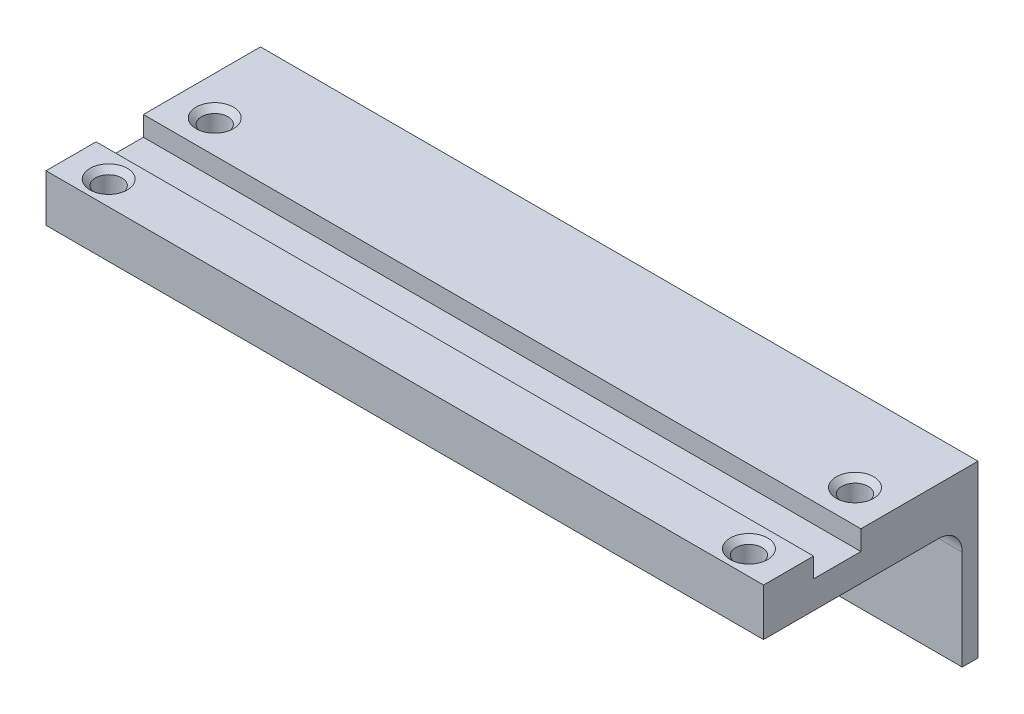
ISO-10303-21;
HEADER;
FILE_DESCRIPTION(('STEP AP214'),'2;1');
FILE_NAME('part.step','',(''),(''),'','','');
FILE_SCHEMA(('AUTOMOTIVE_DESIGN { 1 0 10303 214 1 1 1 1 }'));
ENDSEC;
DATA;
#1=APPLICATION_CONTEXT('core data for automotive mechanical design processes');
#2=APPLICATION_PROTOCOL_DEFINITION('international standard','automotive_design',2000,#1);
#3=PRODUCT_CONTEXT('',#1,'mechanical');
#4=PRODUCT('Part','Part','',(#3));
#5=PRODUCT_RELATED_PRODUCT_CATEGORY('part','',(#4));
#6=PRODUCT_DEFINITION_FORMATION('','',#4);
#7=PRODUCT_DEFINITION_CONTEXT('part definition',#1,'design');
#8=PRODUCT_DEFINITION('design','',#6,#7);
#9=PRODUCT_DEFINITION_SHAPE('','',#8);
#10=(LENGTH_UNIT() NAMED_UNIT(*) SI_UNIT(.MILLI.,.METRE.));
#11=(NAMED_UNIT(*) PLANE_ANGLE_UNIT() SI_UNIT($,.RADIAN.));
#12=(NAMED_UNIT(*) SI_UNIT($,.STERADIAN.) SOLID_ANGLE_UNIT());
#13=UNCERTAINTY_MEASURE_WITH_UNIT(LENGTH_MEASURE(1.E-05),#10,'distance_accuracy_value','');
#14=(GEOMETRIC_REPRESENTATION_CONTEXT(3) GLOBAL_UNCERTAINTY_ASSIGNED_CONTEXT((#13)) GLOBAL_UNIT_ASSIGNED_CONTEXT((#10,
#11,#12)) REPRESENTATION_CONTEXT('',''));
#15=CARTESIAN_POINT('',(0.,0.,0.));
#16=DIRECTION('',(0.,0.,1.));
#17=DIRECTION('',(1.,0.,0.));
#18=AXIS2_PLACEMENT_3D('',#15,#16,#17);
#19=CARTESIAN_POINT('',(0.,4.,0.));
#20=DIRECTION('',(0.,1.,0.));
#21=DIRECTION('',(0.,0.,1.));
#22=AXIS2_PLACEMENT_3D('',#19,#20,#21);
#23=PLANE('',#22);
#24=CARTESIAN_POINT('',(-40.6,4.,-3.5));
#25=DIRECTION('',(0.,1.,0.));
#26=DIRECTION('',(0.,0.,1.));
#27=AXIS2_PLACEMENT_3D('',#24,#25,#26);
#28=CIRCLE('',#27,2.375);
#29=CARTESIAN_POINT('',(-40.6,4.,-1.125));
#30=VERTEX_POINT('',#29);
#31=EDGE_CURVE('E255',#30,#30,#28,.F.);
#32=ORIENTED_EDGE('',*,*,#31,.T.);
#33=EDGE_LOOP('',(#32));
#34=FACE_BOUND('',#33,.T.);
#35=CARTESIAN_POINT('',(40.6,4.,-3.5));
#36=DIRECTION('',(0.,1.,0.));
#37=DIRECTION('',(0.,0.,1.));
#38=AXIS2_PLACEMENT_3D('',#35,#36,#37);
#39=CIRCLE('',#38,2.375);
#40=CARTESIAN_POINT('',(40.6,4.,-1.125));
#41=VERTEX_POINT('',#40);
#42=EDGE_CURVE('E252',#41,#41,#39,.F.);
#43=ORIENTED_EDGE('',*,*,#42,.T.);
#44=EDGE_LOOP('',(#43));
#45=FACE_BOUND('',#44,.T.);
#46=DIRECTION('',(0.,0.,1.));
#47=VECTOR('',#46,1.);
#48=CARTESIAN_POINT('',(-45.5,4.,-12.));
#49=LINE('',#48,#47);
#50=CARTESIAN_POINT('',(-45.5,4.,-14.2));
#51=VERTEX_POINT('',#50);
#52=CARTESIAN_POINT('',(-45.5,4.,0.65));
#53=VERTEX_POINT('',#52);
#54=EDGE_CURVE('E237',#51,#53,#49,.T.);
#55=ORIENTED_EDGE('',*,*,#54,.T.);
#56=DIRECTION('',(1.,0.,0.));
#57=VECTOR('',#56,1.);
#58=CARTESIAN_POINT('',(-45.5,4.,0.65));
#59=LINE('',#58,#57);
#60=CARTESIAN_POINT('',(45.5,4.,0.650000000000001));
#61=VERTEX_POINT('',#60);
#62=EDGE_CURVE('E211',#53,#61,#59,.T.);
#63=ORIENTED_EDGE('',*,*,#62,.T.);
#64=DIRECTION('',(0.,0.,-1.));
#65=VECTOR('',#64,1.);
#66=CARTESIAN_POINT('',(45.5,4.,-12.));
#67=LINE('',#66,#65);
#68=CARTESIAN_POINT('',(45.5,4.,-14.2));
#69=VERTEX_POINT('',#68);
#70=EDGE_CURVE('E225',#61,#69,#67,.T.);
#71=ORIENTED_EDGE('',*,*,#70,.T.);
#72=DIRECTION('',(1.,0.,0.));
#73=VECTOR('',#72,1.);
#74=CARTESIAN_POINT('',(45.5,4.,-14.2));
#75=LINE('',#74,#73);
#76=EDGE_CURVE('E203',#51,#69,#75,.T.);
#77=ORIENTED_EDGE('',*,*,#76,.F.);
#78=EDGE_LOOP('',(#55,#63,#71,#77));
#79=FACE_BOUND('',#78,.T.);
#80=ADVANCED_FACE('F41',(#34,#45,#79),#23,.T.);
#81=CARTESIAN_POINT('',(45.5,4.,-12.));
#82=DIRECTION('',(-1.,0.,0.));
#83=DIRECTION('',(0.,0.,1.));
#84=AXIS2_PLACEMENT_3D('',#81,#82,#83);
#85=PLANE('',#84);
#86=DIRECTION('',(0.,0.,1.));
#87=VECTOR('',#86,1.);
#88=CARTESIAN_POINT('',(45.5,1.5,0.65));
#89=LINE('',#88,#87);
#90=CARTESIAN_POINT('',(45.5,1.5,0.65));
#91=VERTEX_POINT('',#90);
#92=CARTESIAN_POINT('',(45.5,1.5,6.65));
#93=VERTEX_POINT('',#92);
#94=EDGE_CURVE('E210',#91,#93,#89,.T.);
#95=ORIENTED_EDGE('',*,*,#94,.T.);
#96=DIRECTION('',(0.,1.,0.));
#97=VECTOR('',#96,1.);
#98=CARTESIAN_POINT('',(45.5,1.5,6.65));
#99=LINE('',#98,#97);
#100=CARTESIAN_POINT('',(45.5,4.,6.65));
#101=VERTEX_POINT('',#100);
#102=EDGE_CURVE('E219',#93,#101,#99,.T.);
#103=ORIENTED_EDGE('',*,*,#102,.T.);
#104=CARTESIAN_POINT('',(45.5,4.,13.));
#105=VERTEX_POINT('',#104);
#106=EDGE_CURVE('E233',#105,#101,#67,.T.);
#107=ORIENTED_EDGE('',*,*,#106,.F.);
#108=DIRECTION('',(0.,1.,0.));
#109=VECTOR('',#108,1.);
#110=CARTESIAN_POINT('',(45.5,-2.,13.));
#111=LINE('',#110,#109);
#112=CARTESIAN_POINT('',(45.5,-2.,13.));
#113=VERTEX_POINT('',#112);
#114=EDGE_CURVE('E144',#113,#105,#111,.T.);
#115=ORIENTED_EDGE('',*,*,#114,.F.);
#116=DIRECTION('',(0.,0.,1.));
#117=VECTOR('',#116,1.);
#118=CARTESIAN_POINT('',(45.5,-2.,-12.2));
#119=LINE('',#118,#117);
#120=CARTESIAN_POINT('',(45.5,-2.,-9.2));
#121=VERTEX_POINT('',#120);
#122=EDGE_CURVE('E134',#121,#113,#119,.T.);
#123=ORIENTED_EDGE('',*,*,#122,.F.);
#124=CARTESIAN_POINT('',(45.5,-5.,-9.2));
#125=DIRECTION('',(-1.,0.,0.));
#126=DIRECTION('',(0.,0.,1.));
#127=AXIS2_PLACEMENT_3D('',#124,#125,#126);
#128=CIRCLE('',#127,3.);
#129=CARTESIAN_POINT('',(45.5,-5.,-12.2));
#130=VERTEX_POINT('',#129);
#131=EDGE_CURVE('E49',#121,#130,#128,.T.);
#132=ORIENTED_EDGE('',*,*,#131,.T.);
#133=DIRECTION('',(0.,1.,0.));
#134=VECTOR('',#133,1.);
#135=CARTESIAN_POINT('',(45.5,-17.62,-12.2));
#136=LINE('',#135,#134);
#137=CARTESIAN_POINT('',(45.5,-17.62,-12.2));
#138=VERTEX_POINT('',#137);
#139=EDGE_CURVE('E196',#138,#130,#136,.T.);
#140=ORIENTED_EDGE('',*,*,#139,.F.);
#141=DIRECTION('',(0.,0.,1.));
#142=VECTOR('',#141,1.);
#143=CARTESIAN_POINT('',(45.5,-17.62,-14.2));
#144=LINE('',#143,#142);
#145=CARTESIAN_POINT('',(45.5,-17.62,-14.2));
#146=VERTEX_POINT('',#145);
#147=EDGE_CURVE('E190',#146,#138,#144,.T.);
#148=ORIENTED_EDGE('',*,*,#147,.F.);
#149=DIRECTION('',(0.,-1.,0.));
#150=VECTOR('',#149,1.);
#151=CARTESIAN_POINT('',(45.5,4.,-14.2));
#152=LINE('',#151,#150);
#153=EDGE_CURVE('E198',#69,#146,#152,.T.);
#154=ORIENTED_EDGE('',*,*,#153,.F.);
#155=ORIENTED_EDGE('',*,*,#70,.F.);
#156=DIRECTION('',(0.,1.,0.));
#157=VECTOR('',#156,1.);
#158=CARTESIAN_POINT('',(45.5,1.5,0.65));
#159=LINE('',#158,#157);
#160=EDGE_CURVE('E229',#91,#61,#159,.T.);
#161=ORIENTED_EDGE('',*,*,#160,.F.);
#162=EDGE_LOOP('',(#95,#103,#107,#115,#123,#132,#140,#148,#154,#155,#161));
#163=FACE_BOUND('',#162,.T.);
#164=ADVANCED_FACE('F267',(#163),#85,.F.);
#165=CARTESIAN_POINT('',(-45.5,4.,-12.));
#166=DIRECTION('',(1.,0.,0.));
#167=DIRECTION('',(0.,0.,-1.));
#168=AXIS2_PLACEMENT_3D('',#165,#166,#167);
#169=PLANE('',#168);
#170=DIRECTION('',(0.,0.,-1.));
#171=VECTOR('',#170,1.);
#172=CARTESIAN_POINT('',(-45.5,-2.,12.));
#173=LINE('',#172,#171);
#174=CARTESIAN_POINT('',(-45.5,-2.,13.));
#175=VERTEX_POINT('',#174);
#176=CARTESIAN_POINT('',(-45.5,-2.,-9.2));
#177=VERTEX_POINT('',#176);
#178=EDGE_CURVE('E124',#175,#177,#173,.T.);
#179=ORIENTED_EDGE('',*,*,#178,.F.);
#180=DIRECTION('',(0.,-1.,0.));
#181=VECTOR('',#180,1.);
#182=CARTESIAN_POINT('',(-45.5,4.,13.));
#183=LINE('',#182,#181);
#184=CARTESIAN_POINT('',(-45.5,4.,13.));
#185=VERTEX_POINT('',#184);
#186=EDGE_CURVE('E129',#185,#175,#183,.T.);
#187=ORIENTED_EDGE('',*,*,#186,.F.);
#188=CARTESIAN_POINT('',(-45.5,4.,6.65));
#189=VERTEX_POINT('',#188);
#190=EDGE_CURVE('E236',#189,#185,#49,.T.);
#191=ORIENTED_EDGE('',*,*,#190,.F.);
#192=DIRECTION('',(0.,1.,0.));
#193=VECTOR('',#192,1.);
#194=CARTESIAN_POINT('',(-45.5,1.5,6.65));
#195=LINE('',#194,#193);
#196=CARTESIAN_POINT('',(-45.5,1.5,6.65));
#197=VERTEX_POINT('',#196);
#198=EDGE_CURVE('E223',#197,#189,#195,.T.);
#199=ORIENTED_EDGE('',*,*,#198,.F.);
#200=DIRECTION('',(0.,0.,1.));
#201=VECTOR('',#200,1.);
#202=CARTESIAN_POINT('',(-45.5,1.5,0.65));
#203=LINE('',#202,#201);
#204=CARTESIAN_POINT('',(-45.5,1.5,0.65));
#205=VERTEX_POINT('',#204);
#206=EDGE_CURVE('E216',#205,#197,#203,.T.);
#207=ORIENTED_EDGE('',*,*,#206,.F.);
#208=DIRECTION('',(0.,1.,0.));
#209=VECTOR('',#208,1.);
#210=CARTESIAN_POINT('',(-45.5,1.5,0.65));
#211=LINE('',#210,#209);
#212=EDGE_CURVE('E226',#205,#53,#211,.T.);
#213=ORIENTED_EDGE('',*,*,#212,.T.);
#214=ORIENTED_EDGE('',*,*,#54,.F.);
#215=DIRECTION('',(0.,1.,0.));
#216=VECTOR('',#215,1.);
#217=CARTESIAN_POINT('',(-45.5,4.,-14.2));
#218=LINE('',#217,#216);
#219=CARTESIAN_POINT('',(-45.5,-17.62,-14.2));
#220=VERTEX_POINT('',#219);
#221=EDGE_CURVE('E200',#220,#51,#218,.T.);
#222=ORIENTED_EDGE('',*,*,#221,.F.);
#223=DIRECTION('',(0.,0.,-1.));
#224=VECTOR('',#223,1.);
#225=CARTESIAN_POINT('',(-45.5,-17.62,-14.2));
#226=LINE('',#225,#224);
#227=CARTESIAN_POINT('',(-45.5,-17.62,-12.2));
#228=VERTEX_POINT('',#227);
#229=EDGE_CURVE('E170',#228,#220,#226,.T.);
#230=ORIENTED_EDGE('',*,*,#229,.F.);
#231=DIRECTION('',(0.,1.,0.));
#232=VECTOR('',#231,1.);
#233=CARTESIAN_POINT('',(-45.5,-17.62,-12.2));
#234=LINE('',#233,#232);
#235=CARTESIAN_POINT('',(-45.5,-5.,-12.2));
#236=VERTEX_POINT('',#235);
#237=EDGE_CURVE('E194',#228,#236,#234,.T.);
#238=ORIENTED_EDGE('',*,*,#237,.T.);
#239=CARTESIAN_POINT('',(-45.5,-5.,-9.2));
#240=DIRECTION('',(1.,0.,0.));
#241=DIRECTION('',(0.,0.,-1.));
#242=AXIS2_PLACEMENT_3D('',#239,#240,#241);
#243=CIRCLE('',#242,3.);
#244=EDGE_CURVE('E11',#236,#177,#243,.T.);
#245=ORIENTED_EDGE('',*,*,#244,.T.);
#246=EDGE_LOOP('',(#179,#187,#191,#199,#207,#213,#214,#222,#230,#238,#245));
#247=FACE_BOUND('',#246,.T.);
#248=ADVANCED_FACE('F126',(#247),#169,.F.);
#249=CARTESIAN_POINT('',(-40.6,4.,9.95));
#250=DIRECTION('',(0.,1.,0.));
#251=DIRECTION('',(0.,0.,1.));
#252=AXIS2_PLACEMENT_3D('',#249,#250,#251);
#253=CIRCLE('',#252,2.375);
#254=CARTESIAN_POINT('',(-40.6,4.,12.325));
#255=VERTEX_POINT('',#254);
#256=EDGE_CURVE('E246',#255,#255,#253,.F.);
#257=ORIENTED_EDGE('',*,*,#256,.T.);
#258=EDGE_LOOP('',(#257));
#259=FACE_BOUND('',#258,.T.);
#260=CARTESIAN_POINT('',(40.6,4.,9.95));
#261=DIRECTION('',(0.,1.,0.));
#262=DIRECTION('',(0.,0.,1.));
#263=AXIS2_PLACEMENT_3D('',#260,#261,#262);
#264=CIRCLE('',#263,2.375);
#265=CARTESIAN_POINT('',(40.6,4.,12.325));
#266=VERTEX_POINT('',#265);
#267=EDGE_CURVE('E243',#266,#266,#264,.F.);
#268=ORIENTED_EDGE('',*,*,#267,.T.);
#269=EDGE_LOOP('',(#268));
#270=FACE_BOUND('',#269,.T.);
#271=DIRECTION('',(1.,0.,0.));
#272=VECTOR('',#271,1.);
#273=CARTESIAN_POINT('',(-45.5,4.,6.65));
#274=LINE('',#273,#272);
#275=EDGE_CURVE('E206',#189,#101,#274,.T.);
#276=ORIENTED_EDGE('',*,*,#275,.F.);
#277=ORIENTED_EDGE('',*,*,#190,.T.);
#278=DIRECTION('',(-1.,0.,0.));
#279=VECTOR('',#278,1.);
#280=CARTESIAN_POINT('',(45.5,4.,13.));
#281=LINE('',#280,#279);
#282=EDGE_CURVE('E149',#105,#185,#281,.T.);
#283=ORIENTED_EDGE('',*,*,#282,.F.);
#284=ORIENTED_EDGE('',*,*,#106,.T.);
#285=EDGE_LOOP('',(#276,#277,#283,#284));
#286=FACE_BOUND('',#285,.T.);
#287=ADVANCED_FACE('F270',(#259,#270,#286),#23,.T.);
#288=CARTESIAN_POINT('',(-40.6,0.,9.95));
#289=DIRECTION('',(0.,1.,0.));
#290=DIRECTION('',(0.,0.,1.));
#291=AXIS2_PLACEMENT_3D('',#288,#289,#290);
#292=CYLINDRICAL_SURFACE('',#291,1.675);
#293=CARTESIAN_POINT('',(-40.6,3.30000000000001,9.95));
#294=DIRECTION('',(0.,1.,0.));
#295=DIRECTION('',(0.,0.,1.));
#296=AXIS2_PLACEMENT_3D('',#293,#294,#295);
#297=CIRCLE('',#296,1.675);
#298=CARTESIAN_POINT('',(-40.6,3.30000000000001,11.625));
#299=VERTEX_POINT('',#298);
#300=EDGE_CURVE('E240',#299,#299,#297,.T.);
#301=ORIENTED_EDGE('',*,*,#300,.T.);
#302=EDGE_LOOP('',(#301));
#303=FACE_BOUND('',#302,.T.);
#304=CARTESIAN_POINT('',(-40.6,-2.,9.95));
#305=DIRECTION('',(0.,-1.,0.));
#306=DIRECTION('',(0.,0.,-1.));
#307=AXIS2_PLACEMENT_3D('',#304,#305,#306);
#308=CIRCLE('',#307,1.675);
#309=CARTESIAN_POINT('',(-40.6,-2.,8.275));
#310=VERTEX_POINT('',#309);
#311=EDGE_CURVE('E154',#310,#310,#308,.T.);
#312=ORIENTED_EDGE('',*,*,#311,.T.);
#313=EDGE_LOOP('',(#312));
#314=FACE_BOUND('',#313,.T.);
#315=ADVANCED_FACE('F314',(#303,#314),#292,.F.);
#316=CARTESIAN_POINT('',(40.6,0.,-3.5));
#317=DIRECTION('',(0.,1.,0.));
#318=DIRECTION('',(0.,0.,1.));
#319=AXIS2_PLACEMENT_3D('',#316,#317,#318);
#320=CYLINDRICAL_SURFACE('',#319,1.675);
#321=CARTESIAN_POINT('',(40.6,3.30000000000001,-3.5));
#322=DIRECTION('',(0.,1.,0.));
#323=DIRECTION('',(0.,0.,1.));
#324=AXIS2_PLACEMENT_3D('',#321,#322,#323);
#325=CIRCLE('',#324,1.675);
#326=CARTESIAN_POINT('',(40.6,3.30000000000001,-1.825));
#327=VERTEX_POINT('',#326);
#328=EDGE_CURVE('E258',#327,#327,#325,.T.);
#329=ORIENTED_EDGE('',*,*,#328,.T.);
#330=EDGE_LOOP('',(#329));
#331=FACE_BOUND('',#330,.T.);
#332=CARTESIAN_POINT('',(40.6,-2.,-3.5));
#333=DIRECTION('',(0.,-1.,0.));
#334=DIRECTION('',(0.,0.,-1.));
#335=AXIS2_PLACEMENT_3D('',#332,#333,#334);
#336=CIRCLE('',#335,1.675);
#337=CARTESIAN_POINT('',(40.6,-2.,-5.175));
#338=VERTEX_POINT('',#337);
#339=EDGE_CURVE('E160',#338,#338,#336,.T.);
#340=ORIENTED_EDGE('',*,*,#339,.T.);
#341=EDGE_LOOP('',(#340));
#342=FACE_BOUND('',#341,.T.);
#343=ADVANCED_FACE('F319',(#331,#342),#320,.F.);
#344=CARTESIAN_POINT('',(-40.6,0.,-3.5));
#345=DIRECTION('',(0.,1.,0.));
#346=DIRECTION('',(0.,0.,1.));
#347=AXIS2_PLACEMENT_3D('',#344,#345,#346);
#348=CYLINDRICAL_SURFACE('',#347,1.675);
#349=CARTESIAN_POINT('',(-40.6,3.30000000000001,-3.5));
#350=DIRECTION('',(0.,1.,0.));
#351=DIRECTION('',(0.,0.,1.));
#352=AXIS2_PLACEMENT_3D('',#349,#350,#351);
#353=CIRCLE('',#352,1.675);
#354=CARTESIAN_POINT('',(-40.6,3.30000000000001,-1.825));
#355=VERTEX_POINT('',#354);
#356=EDGE_CURVE('E249',#355,#355,#353,.T.);
#357=ORIENTED_EDGE('',*,*,#356,.T.);
#358=EDGE_LOOP('',(#357));
#359=FACE_BOUND('',#358,.T.);
#360=CARTESIAN_POINT('',(-40.6,-2.,-3.5));
#361=DIRECTION('',(0.,-1.,0.));
#362=DIRECTION('',(0.,0.,-1.));
#363=AXIS2_PLACEMENT_3D('',#360,#361,#362);
#364=CIRCLE('',#363,1.675);
#365=CARTESIAN_POINT('',(-40.6,-2.,-5.175));
#366=VERTEX_POINT('',#365);
#367=EDGE_CURVE('E157',#366,#366,#364,.T.);
#368=ORIENTED_EDGE('',*,*,#367,.T.);
#369=EDGE_LOOP('',(#368));
#370=FACE_BOUND('',#369,.T.);
#371=ADVANCED_FACE('F331',(#359,#370),#348,.F.);
#372=CARTESIAN_POINT('',(40.6,0.,9.95));
#373=DIRECTION('',(0.,1.,0.));
#374=DIRECTION('',(0.,0.,1.));
#375=AXIS2_PLACEMENT_3D('',#372,#373,#374);
#376=CYLINDRICAL_SURFACE('',#375,1.675);
#377=CARTESIAN_POINT('',(40.6,3.30000000000001,9.95));
#378=DIRECTION('',(0.,1.,0.));
#379=DIRECTION('',(0.,0.,1.));
#380=AXIS2_PLACEMENT_3D('',#377,#378,#379);
#381=CIRCLE('',#380,1.675);
#382=CARTESIAN_POINT('',(40.6,3.30000000000001,11.625));
#383=VERTEX_POINT('',#382);
#384=EDGE_CURVE('E261',#383,#383,#381,.T.);
#385=ORIENTED_EDGE('',*,*,#384,.T.);
#386=EDGE_LOOP('',(#385));
#387=FACE_BOUND('',#386,.T.);
#388=CARTESIAN_POINT('',(40.6,-2.,9.95));
#389=DIRECTION('',(0.,-1.,0.));
#390=DIRECTION('',(0.,0.,-1.));
#391=AXIS2_PLACEMENT_3D('',#388,#389,#390);
#392=CIRCLE('',#391,1.675);
#393=CARTESIAN_POINT('',(40.6,-2.,8.275));
#394=VERTEX_POINT('',#393);
#395=EDGE_CURVE('E135',#394,#394,#392,.T.);
#396=ORIENTED_EDGE('',*,*,#395,.T.);
#397=EDGE_LOOP('',(#396));
#398=FACE_BOUND('',#397,.T.);
#399=ADVANCED_FACE('F328',(#387,#398),#376,.F.);
#400=CARTESIAN_POINT('',(-45.5,1.5,6.65));
#401=DIRECTION('',(0.,0.,1.));
#402=DIRECTION('',(1.,0.,0.));
#403=AXIS2_PLACEMENT_3D('',#400,#401,#402);
#404=PLANE('',#403);
#405=ORIENTED_EDGE('',*,*,#275,.T.);
#406=ORIENTED_EDGE('',*,*,#102,.F.);
#407=DIRECTION('',(1.,0.,0.));
#408=VECTOR('',#407,1.);
#409=CARTESIAN_POINT('',(-45.5,1.5,6.65));
#410=LINE('',#409,#408);
#411=EDGE_CURVE('E207',#197,#93,#410,.T.);
#412=ORIENTED_EDGE('',*,*,#411,.F.);
#413=ORIENTED_EDGE('',*,*,#198,.T.);
#414=EDGE_LOOP('',(#405,#406,#412,#413));
#415=FACE_BOUND('',#414,.T.);
#416=ADVANCED_FACE('F274',(#415),#404,.F.);
#417=CARTESIAN_POINT('',(-45.5,1.5,0.65));
#418=DIRECTION('',(0.,0.,1.));
#419=DIRECTION('',(1.,0.,0.));
#420=AXIS2_PLACEMENT_3D('',#417,#418,#419);
#421=PLANE('',#420);
#422=ORIENTED_EDGE('',*,*,#62,.F.);
#423=ORIENTED_EDGE('',*,*,#212,.F.);
#424=DIRECTION('',(1.,0.,0.));
#425=VECTOR('',#424,1.);
#426=CARTESIAN_POINT('',(-45.5,1.5,0.65));
#427=LINE('',#426,#425);
#428=EDGE_CURVE('E214',#205,#91,#427,.T.);
#429=ORIENTED_EDGE('',*,*,#428,.T.);
#430=ORIENTED_EDGE('',*,*,#160,.T.);
#431=EDGE_LOOP('',(#422,#423,#429,#430));
#432=FACE_BOUND('',#431,.T.);
#433=ADVANCED_FACE('F281',(#432),#421,.T.);
#434=CARTESIAN_POINT('',(0.,1.5,0.));
#435=DIRECTION('',(0.,-1.,0.));
#436=DIRECTION('',(0.,0.,-1.));
#437=AXIS2_PLACEMENT_3D('',#434,#435,#436);
#438=PLANE('',#437);
#439=ORIENTED_EDGE('',*,*,#411,.T.);
#440=ORIENTED_EDGE('',*,*,#94,.F.);
#441=ORIENTED_EDGE('',*,*,#428,.F.);
#442=ORIENTED_EDGE('',*,*,#206,.T.);
#443=EDGE_LOOP('',(#439,#440,#441,#442));
#444=FACE_BOUND('',#443,.T.);
#445=ADVANCED_FACE('F278',(#444),#438,.F.);
#446=CARTESIAN_POINT('',(0.,0.,-14.2));
#447=DIRECTION('',(0.,0.,-1.));
#448=DIRECTION('',(-1.,0.,0.));
#449=AXIS2_PLACEMENT_3D('',#446,#447,#448);
#450=PLANE('',#449);
#451=CARTESIAN_POINT('',(-21.25,-10.12,-14.2));
#452=DIRECTION('',(0.,0.,1.));
#453=DIRECTION('',(1.,0.,0.));
#454=AXIS2_PLACEMENT_3D('',#451,#452,#453);
#455=CIRCLE('',#454,1.75);
#456=CARTESIAN_POINT('',(-19.5,-10.12,-14.2));
#457=VERTEX_POINT('',#456);
#458=EDGE_CURVE('E167',#457,#457,#455,.T.);
#459=ORIENTED_EDGE('',*,*,#458,.T.);
#460=EDGE_LOOP('',(#459));
#461=FACE_BOUND('',#460,.T.);
#462=CARTESIAN_POINT('',(0.,-10.12,-14.2));
#463=DIRECTION('',(0.,0.,1.));
#464=DIRECTION('',(1.,0.,0.));
#465=AXIS2_PLACEMENT_3D('',#462,#463,#464);
#466=CIRCLE('',#465,1.75);
#467=CARTESIAN_POINT('',(1.75,-10.12,-14.2));
#468=VERTEX_POINT('',#467);
#469=EDGE_CURVE('E177',#468,#468,#466,.T.);
#470=ORIENTED_EDGE('',*,*,#469,.T.);
#471=EDGE_LOOP('',(#470));
#472=FACE_BOUND('',#471,.T.);
#473=CARTESIAN_POINT('',(21.25,-10.12,-14.2));
#474=DIRECTION('',(0.,0.,1.));
#475=DIRECTION('',(1.,0.,0.));
#476=AXIS2_PLACEMENT_3D('',#473,#474,#475);
#477=CIRCLE('',#476,1.75);
#478=CARTESIAN_POINT('',(23.,-10.12,-14.2));
#479=VERTEX_POINT('',#478);
#480=EDGE_CURVE('E166',#479,#479,#477,.T.);
#481=ORIENTED_EDGE('',*,*,#480,.T.);
#482=EDGE_LOOP('',(#481));
#483=FACE_BOUND('',#482,.T.);
#484=ORIENTED_EDGE('',*,*,#153,.T.);
#485=DIRECTION('',(1.,0.,0.));
#486=VECTOR('',#485,1.);
#487=CARTESIAN_POINT('',(-45.5,-17.62,-14.2));
#488=LINE('',#487,#486);
#489=EDGE_CURVE('E187',#220,#146,#488,.T.);
#490=ORIENTED_EDGE('',*,*,#489,.F.);
#491=ORIENTED_EDGE('',*,*,#221,.T.);
#492=ORIENTED_EDGE('',*,*,#76,.T.);
#493=EDGE_LOOP('',(#484,#490,#491,#492));
#494=FACE_BOUND('',#493,.T.);
#495=ADVANCED_FACE('F287',(#461,#472,#483,#494),#450,.T.);
#496=CARTESIAN_POINT('',(-45.5,-17.62,-12.2));
#497=DIRECTION('',(0.,0.,-1.));
#498=DIRECTION('',(-1.,0.,0.));
#499=AXIS2_PLACEMENT_3D('',#496,#497,#498);
#500=PLANE('',#499);
#501=CARTESIAN_POINT('',(-21.25,-10.12,-12.2));
#502=DIRECTION('',(0.,0.,1.));
#503=DIRECTION('',(1.,0.,0.));
#504=AXIS2_PLACEMENT_3D('',#501,#502,#503);
#505=CIRCLE('',#504,1.75);
#506=CARTESIAN_POINT('',(-19.5,-10.12,-12.2));
#507=VERTEX_POINT('',#506);
#508=EDGE_CURVE('E171',#507,#507,#505,.T.);
#509=ORIENTED_EDGE('',*,*,#508,.F.);
#510=EDGE_LOOP('',(#509));
#511=FACE_BOUND('',#510,.T.);
#512=CARTESIAN_POINT('',(0.,-10.12,-12.2));
#513=DIRECTION('',(0.,0.,1.));
#514=DIRECTION('',(1.,0.,0.));
#515=AXIS2_PLACEMENT_3D('',#512,#513,#514);
#516=CIRCLE('',#515,1.75);
#517=CARTESIAN_POINT('',(1.75,-10.12,-12.2));
#518=VERTEX_POINT('',#517);
#519=EDGE_CURVE('E174',#518,#518,#516,.T.);
#520=ORIENTED_EDGE('',*,*,#519,.F.);
#521=EDGE_LOOP('',(#520));
#522=FACE_BOUND('',#521,.T.);
#523=CARTESIAN_POINT('',(21.25,-10.12,-12.2));
#524=DIRECTION('',(0.,0.,1.));
#525=DIRECTION('',(1.,0.,0.));
#526=AXIS2_PLACEMENT_3D('',#523,#524,#525);
#527=CIRCLE('',#526,1.75);
#528=CARTESIAN_POINT('',(23.,-10.12,-12.2));
#529=VERTEX_POINT('',#528);
#530=EDGE_CURVE('E180',#529,#529,#527,.T.);
#531=ORIENTED_EDGE('',*,*,#530,.F.);
#532=EDGE_LOOP('',(#531));
#533=FACE_BOUND('',#532,.T.);
#534=ORIENTED_EDGE('',*,*,#139,.T.);
#535=DIRECTION('',(1.,0.,0.));
#536=VECTOR('',#535,1.);
#537=CARTESIAN_POINT('',(-45.5,-5.,-12.2));
#538=LINE('',#537,#536);
#539=EDGE_CURVE('E56',#130,#236,#538,.F.);
#540=ORIENTED_EDGE('',*,*,#539,.T.);
#541=ORIENTED_EDGE('',*,*,#237,.F.);
#542=DIRECTION('',(-1.,0.,0.));
#543=VECTOR('',#542,1.);
#544=CARTESIAN_POINT('',(-45.5,-17.62,-12.2));
#545=LINE('',#544,#543);
#546=EDGE_CURVE('E192',#138,#228,#545,.T.);
#547=ORIENTED_EDGE('',*,*,#546,.F.);
#548=EDGE_LOOP('',(#534,#540,#541,#547));
#549=FACE_BOUND('',#548,.T.);
#550=ADVANCED_FACE('F358',(#511,#522,#533,#549),#500,.F.);
#551=CARTESIAN_POINT('',(0.,-17.62,0.));
#552=DIRECTION('',(0.,1.,0.));
#553=DIRECTION('',(0.,0.,1.));
#554=AXIS2_PLACEMENT_3D('',#551,#552,#553);
#555=PLANE('',#554);
#556=ORIENTED_EDGE('',*,*,#229,.T.);
#557=ORIENTED_EDGE('',*,*,#489,.T.);
#558=ORIENTED_EDGE('',*,*,#147,.T.);
#559=ORIENTED_EDGE('',*,*,#546,.T.);
#560=EDGE_LOOP('',(#556,#557,#558,#559));
#561=FACE_BOUND('',#560,.T.);
#562=ADVANCED_FACE('F292',(#561),#555,.F.);
#563=CARTESIAN_POINT('',(21.25,-10.12,-14.2));
#564=DIRECTION('',(0.,0.,1.));
#565=DIRECTION('',(1.,0.,0.));
#566=AXIS2_PLACEMENT_3D('',#563,#564,#565);
#567=CYLINDRICAL_SURFACE('',#566,1.75);
#568=ORIENTED_EDGE('',*,*,#480,.F.);
#569=EDGE_LOOP('',(#568));
#570=FACE_BOUND('',#569,.T.);
#571=ORIENTED_EDGE('',*,*,#530,.T.);
#572=EDGE_LOOP('',(#571));
#573=FACE_BOUND('',#572,.T.);
#574=ADVANCED_FACE('F351',(#570,#573),#567,.F.);
#575=CARTESIAN_POINT('',(0.,-10.12,-14.2));
#576=DIRECTION('',(0.,0.,1.));
#577=DIRECTION('',(1.,0.,0.));
#578=AXIS2_PLACEMENT_3D('',#575,#576,#577);
#579=CYLINDRICAL_SURFACE('',#578,1.75);
#580=ORIENTED_EDGE('',*,*,#469,.F.);
#581=EDGE_LOOP('',(#580));
#582=FACE_BOUND('',#581,.T.);
#583=ORIENTED_EDGE('',*,*,#519,.T.);
#584=EDGE_LOOP('',(#583));
#585=FACE_BOUND('',#584,.T.);
#586=ADVANCED_FACE('F344',(#582,#585),#579,.F.);
#587=CARTESIAN_POINT('',(-21.25,-10.12,-14.2));
#588=DIRECTION('',(0.,0.,1.));
#589=DIRECTION('',(1.,0.,0.));
#590=AXIS2_PLACEMENT_3D('',#587,#588,#589);
#591=CYLINDRICAL_SURFACE('',#590,1.75);
#592=ORIENTED_EDGE('',*,*,#458,.F.);
#593=EDGE_LOOP('',(#592));
#594=FACE_BOUND('',#593,.T.);
#595=ORIENTED_EDGE('',*,*,#508,.T.);
#596=EDGE_LOOP('',(#595));
#597=FACE_BOUND('',#596,.T.);
#598=ADVANCED_FACE('F335',(#594,#597),#591,.F.);
#599=CARTESIAN_POINT('',(0.,-2.,0.));
#600=DIRECTION('',(0.,-1.,0.));
#601=DIRECTION('',(0.,0.,-1.));
#602=AXIS2_PLACEMENT_3D('',#599,#600,#601);
#603=PLANE('',#602);
#604=ORIENTED_EDGE('',*,*,#367,.F.);
#605=EDGE_LOOP('',(#604));
#606=FACE_BOUND('',#605,.T.);
#607=ORIENTED_EDGE('',*,*,#395,.F.);
#608=EDGE_LOOP('',(#607));
#609=FACE_BOUND('',#608,.T.);
#610=ORIENTED_EDGE('',*,*,#178,.T.);
#611=DIRECTION('',(1.,0.,0.));
#612=VECTOR('',#611,1.);
#613=CARTESIAN_POINT('',(0.,-2.,-9.2));
#614=LINE('',#613,#612);
#615=EDGE_CURVE('E264',#177,#121,#614,.T.);
#616=ORIENTED_EDGE('',*,*,#615,.T.);
#617=ORIENTED_EDGE('',*,*,#122,.T.);
#618=DIRECTION('',(1.,0.,0.));
#619=VECTOR('',#618,1.);
#620=CARTESIAN_POINT('',(-45.5,-2.,13.));
#621=LINE('',#620,#619);
#622=EDGE_CURVE('E138',#175,#113,#621,.T.);
#623=ORIENTED_EDGE('',*,*,#622,.F.);
#624=EDGE_LOOP('',(#610,#616,#617,#623));
#625=FACE_BOUND('',#624,.T.);
#626=ORIENTED_EDGE('',*,*,#339,.F.);
#627=EDGE_LOOP('',(#626));
#628=FACE_BOUND('',#627,.T.);
#629=ORIENTED_EDGE('',*,*,#311,.F.);
#630=EDGE_LOOP('',(#629));
#631=FACE_BOUND('',#630,.T.);
#632=ADVANCED_FACE('F139',(#606,#609,#625,#628,#631),#603,.T.);
#633=CARTESIAN_POINT('',(0.,0.,13.));
#634=DIRECTION('',(0.,0.,1.));
#635=DIRECTION('',(1.,0.,0.));
#636=AXIS2_PLACEMENT_3D('',#633,#634,#635);
#637=PLANE('',#636);
#638=ORIENTED_EDGE('',*,*,#186,.T.);
#639=ORIENTED_EDGE('',*,*,#622,.T.);
#640=ORIENTED_EDGE('',*,*,#114,.T.);
#641=ORIENTED_EDGE('',*,*,#282,.T.);
#642=EDGE_LOOP('',(#638,#639,#640,#641));
#643=FACE_BOUND('',#642,.T.);
#644=ADVANCED_FACE('F147',(#643),#637,.T.);
#645=CARTESIAN_POINT('',(-40.6,3.30000000000001,9.95));
#646=DIRECTION('',(0.,1.,0.));
#647=DIRECTION('',(0.,0.,1.));
#648=AXIS2_PLACEMENT_3D('',#645,#646,#647);
#649=CONICAL_SURFACE('',#648,1.675,0.785398163397453);
#650=ORIENTED_EDGE('',*,*,#256,.F.);
#651=EDGE_LOOP('',(#650));
#652=FACE_BOUND('',#651,.T.);
#653=ORIENTED_EDGE('',*,*,#300,.F.);
#654=EDGE_LOOP('',(#653));
#655=FACE_BOUND('',#654,.T.);
#656=ADVANCED_FACE('F341',(#652,#655),#649,.F.);
#657=CARTESIAN_POINT('',(-40.6,3.30000000000001,-3.5));
#658=DIRECTION('',(0.,1.,0.));
#659=DIRECTION('',(0.,0.,1.));
#660=AXIS2_PLACEMENT_3D('',#657,#658,#659);
#661=CONICAL_SURFACE('',#660,1.675,0.785398163397453);
#662=ORIENTED_EDGE('',*,*,#31,.F.);
#663=EDGE_LOOP('',(#662));
#664=FACE_BOUND('',#663,.T.);
#665=ORIENTED_EDGE('',*,*,#356,.F.);
#666=EDGE_LOOP('',(#665));
#667=FACE_BOUND('',#666,.T.);
#668=ADVANCED_FACE('F380',(#664,#667),#661,.F.);
#669=CARTESIAN_POINT('',(40.6,3.30000000000001,-3.5));
#670=DIRECTION('',(0.,1.,0.));
#671=DIRECTION('',(0.,0.,1.));
#672=AXIS2_PLACEMENT_3D('',#669,#670,#671);
#673=CONICAL_SURFACE('',#672,1.675,0.785398163397453);
#674=ORIENTED_EDGE('',*,*,#42,.F.);
#675=EDGE_LOOP('',(#674));
#676=FACE_BOUND('',#675,.T.);
#677=ORIENTED_EDGE('',*,*,#328,.F.);
#678=EDGE_LOOP('',(#677));
#679=FACE_BOUND('',#678,.T.);
#680=ADVANCED_FACE('F300',(#676,#679),#673,.F.);
#681=CARTESIAN_POINT('',(40.6,3.30000000000001,9.95));
#682=DIRECTION('',(0.,1.,0.));
#683=DIRECTION('',(0.,0.,1.));
#684=AXIS2_PLACEMENT_3D('',#681,#682,#683);
#685=CONICAL_SURFACE('',#684,1.675,0.785398163397453);
#686=ORIENTED_EDGE('',*,*,#267,.F.);
#687=EDGE_LOOP('',(#686));
#688=FACE_BOUND('',#687,.T.);
#689=ORIENTED_EDGE('',*,*,#384,.F.);
#690=EDGE_LOOP('',(#689));
#691=FACE_BOUND('',#690,.T.);
#692=ADVANCED_FACE('F295',(#688,#691),#685,.F.);
#693=CARTESIAN_POINT('',(0.,-5.,-9.2));
#694=DIRECTION('',(1.,0.,0.));
#695=DIRECTION('',(0.,0.,-1.));
#696=AXIS2_PLACEMENT_3D('',#693,#694,#695);
#697=CYLINDRICAL_SURFACE('',#696,3.);
#698=ORIENTED_EDGE('',*,*,#244,.F.);
#699=ORIENTED_EDGE('',*,*,#539,.F.);
#700=ORIENTED_EDGE('',*,*,#131,.F.);
#701=ORIENTED_EDGE('',*,*,#615,.F.);
#702=EDGE_LOOP('',(#698,#699,#700,#701));
#703=FACE_BOUND('',#702,.T.);
#704=ADVANCED_FACE('F43',(#703),#697,.F.);
#705=CLOSED_SHELL('',(#80,#164,#248,#287,#315,#343,#371,#399,#416,#433,#445,#495,#550,#562,#574,
#586,#598,#632,#644,#656,#668,#680,#692,#704));
#706=MANIFOLD_SOLID_BREP('B2',#705);
#707=ADVANCED_BREP_SHAPE_REPRESENTATION('',(#18,#706),#14);
#708=SHAPE_DEFINITION_REPRESENTATION(#9,#707);
ENDSEC;
END-ISO-10303-21;
